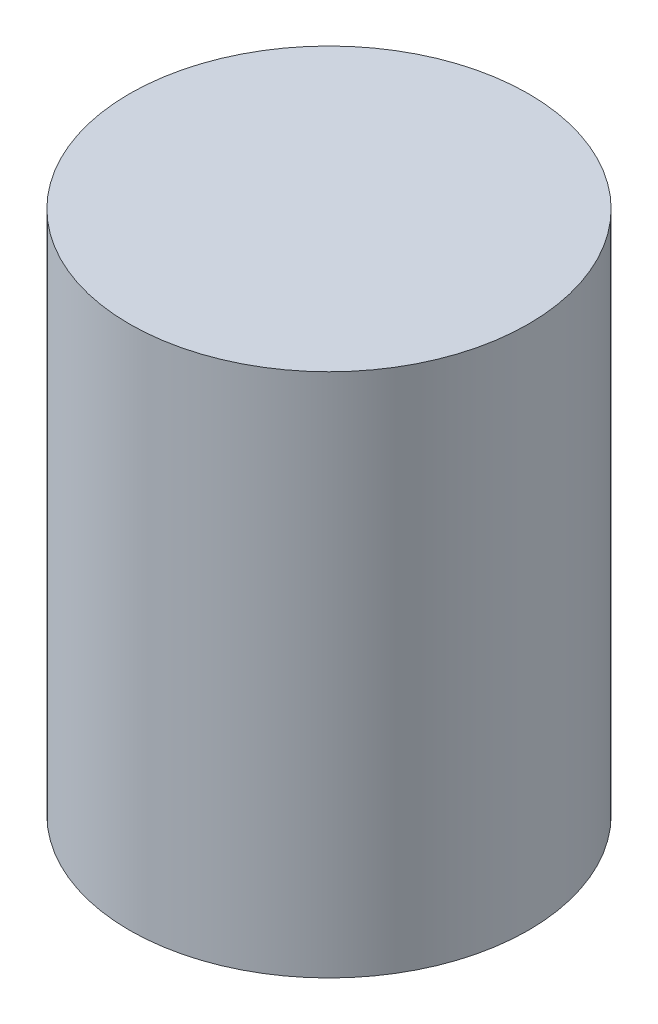
ISO-10303-21;
HEADER;
FILE_DESCRIPTION(('STEP AP214'),'2;1');
FILE_NAME('part.step','',(''),(''),'','','');
FILE_SCHEMA(('AUTOMOTIVE_DESIGN { 1 0 10303 214 1 1 1 1 }'));
ENDSEC;
DATA;
#1=APPLICATION_CONTEXT('core data for automotive mechanical design processes');
#2=APPLICATION_PROTOCOL_DEFINITION('international standard','automotive_design',2000,#1);
#3=PRODUCT_CONTEXT('',#1,'mechanical');
#4=PRODUCT('Part','Part','',(#3));
#5=PRODUCT_RELATED_PRODUCT_CATEGORY('part','',(#4));
#6=PRODUCT_DEFINITION_FORMATION('','',#4);
#7=PRODUCT_DEFINITION_CONTEXT('part definition',#1,'design');
#8=PRODUCT_DEFINITION('design','',#6,#7);
#9=PRODUCT_DEFINITION_SHAPE('','',#8);
#10=(LENGTH_UNIT() NAMED_UNIT(*) SI_UNIT(.MILLI.,.METRE.));
#11=(NAMED_UNIT(*) PLANE_ANGLE_UNIT() SI_UNIT($,.RADIAN.));
#12=(NAMED_UNIT(*) SI_UNIT($,.STERADIAN.) SOLID_ANGLE_UNIT());
#13=UNCERTAINTY_MEASURE_WITH_UNIT(LENGTH_MEASURE(1.E-05),#10,'distance_accuracy_value','');
#14=(GEOMETRIC_REPRESENTATION_CONTEXT(3) GLOBAL_UNCERTAINTY_ASSIGNED_CONTEXT((#13)) GLOBAL_UNIT_ASSIGNED_CONTEXT((#10,
#11,#12)) REPRESENTATION_CONTEXT('',''));
#15=CARTESIAN_POINT('',(0.,0.,0.));
#16=DIRECTION('',(0.,0.,1.));
#17=DIRECTION('',(1.,0.,0.));
#18=AXIS2_PLACEMENT_3D('',#15,#16,#17);
#19=CARTESIAN_POINT('',(0.,25.,0.));
#20=DIRECTION('',(0.,-1.,0.));
#21=DIRECTION('',(0.,0.,-1.));
#22=AXIS2_PLACEMENT_3D('',#19,#20,#21);
#23=CYLINDRICAL_SURFACE('',#22,9.5);
#24=CARTESIAN_POINT('',(0.,25.,0.));
#25=DIRECTION('',(0.,1.,0.));
#26=DIRECTION('',(0.,0.,1.));
#27=AXIS2_PLACEMENT_3D('',#24,#25,#26);
#28=CIRCLE('',#27,9.5);
#29=CARTESIAN_POINT('',(0.,25.,9.5));
#30=VERTEX_POINT('',#29);
#31=EDGE_CURVE('E10',#30,#30,#28,.T.);
#32=ORIENTED_EDGE('',*,*,#31,.F.);
#33=EDGE_LOOP('',(#32));
#34=FACE_BOUND('',#33,.T.);
#35=CARTESIAN_POINT('',(0.,0.,0.));
#36=DIRECTION('',(0.,1.,0.));
#37=DIRECTION('',(0.,0.,1.));
#38=AXIS2_PLACEMENT_3D('',#35,#36,#37);
#39=CIRCLE('',#38,9.5);
#40=CARTESIAN_POINT('',(0.,0.,9.5));
#41=VERTEX_POINT('',#40);
#42=EDGE_CURVE('E34',#41,#41,#39,.T.);
#43=ORIENTED_EDGE('',*,*,#42,.T.);
#44=EDGE_LOOP('',(#43));
#45=FACE_BOUND('',#44,.T.);
#46=ADVANCED_FACE('F31',(#34,#45),#23,.T.);
#47=CARTESIAN_POINT('',(0.,25.,0.));
#48=DIRECTION('',(0.,1.,0.));
#49=DIRECTION('',(0.,0.,1.));
#50=AXIS2_PLACEMENT_3D('',#47,#48,#49);
#51=PLANE('',#50);
#52=ORIENTED_EDGE('',*,*,#31,.T.);
#53=EDGE_LOOP('',(#52));
#54=FACE_BOUND('',#53,.T.);
#55=ADVANCED_FACE('F46',(#54),#51,.T.);
#56=CARTESIAN_POINT('',(0.,0.,0.));
#57=DIRECTION('',(0.,1.,0.));
#58=DIRECTION('',(0.,0.,1.));
#59=AXIS2_PLACEMENT_3D('',#56,#57,#58);
#60=PLANE('',#59);
#61=ORIENTED_EDGE('',*,*,#42,.F.);
#62=EDGE_LOOP('',(#61));
#63=FACE_BOUND('',#62,.T.);
#64=ADVANCED_FACE('F44',(#63),#60,.F.);
#65=CLOSED_SHELL('',(#46,#55,#64));
#66=MANIFOLD_SOLID_BREP('B2',#65);
#67=ADVANCED_BREP_SHAPE_REPRESENTATION('',(#18,#66),#14);
#68=SHAPE_DEFINITION_REPRESENTATION(#9,#67);
ENDSEC;
END-ISO-10303-21;
